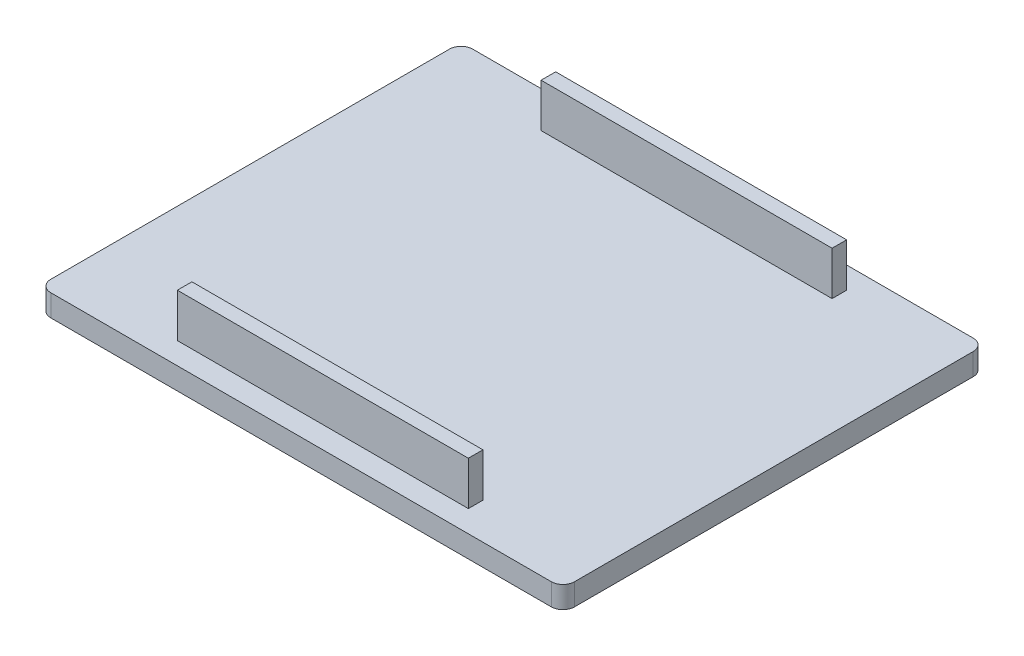
ISO-10303-21;
HEADER;
FILE_DESCRIPTION(('STEP AP214'),'2;1');
FILE_NAME('part.step','',(''),(''),'','','');
FILE_SCHEMA(('AUTOMOTIVE_DESIGN { 1 0 10303 214 1 1 1 1 }'));
ENDSEC;
DATA;
#1=APPLICATION_CONTEXT('core data for automotive mechanical design processes');
#2=APPLICATION_PROTOCOL_DEFINITION('international standard','automotive_design',2000,#1);
#3=PRODUCT_CONTEXT('',#1,'mechanical');
#4=PRODUCT('Part','Part','',(#3));
#5=PRODUCT_RELATED_PRODUCT_CATEGORY('part','',(#4));
#6=PRODUCT_DEFINITION_FORMATION('','',#4);
#7=PRODUCT_DEFINITION_CONTEXT('part definition',#1,'design');
#8=PRODUCT_DEFINITION('design','',#6,#7);
#9=PRODUCT_DEFINITION_SHAPE('','',#8);
#10=(LENGTH_UNIT() NAMED_UNIT(*) SI_UNIT(.MILLI.,.METRE.));
#11=(NAMED_UNIT(*) PLANE_ANGLE_UNIT() SI_UNIT($,.RADIAN.));
#12=(NAMED_UNIT(*) SI_UNIT($,.STERADIAN.) SOLID_ANGLE_UNIT());
#13=UNCERTAINTY_MEASURE_WITH_UNIT(LENGTH_MEASURE(1.E-05),#10,'distance_accuracy_value','');
#14=(GEOMETRIC_REPRESENTATION_CONTEXT(3) GLOBAL_UNCERTAINTY_ASSIGNED_CONTEXT((#13)) GLOBAL_UNIT_ASSIGNED_CONTEXT((#10,
#11,#12)) REPRESENTATION_CONTEXT('',''));
#15=CARTESIAN_POINT('',(0.,0.,0.));
#16=DIRECTION('',(0.,0.,1.));
#17=DIRECTION('',(1.,0.,0.));
#18=AXIS2_PLACEMENT_3D('',#15,#16,#17);
#19=CARTESIAN_POINT('',(0.,1.5,0.));
#20=DIRECTION('',(0.,1.,0.));
#21=DIRECTION('',(0.,0.,1.));
#22=AXIS2_PLACEMENT_3D('',#19,#20,#21);
#23=PLANE('',#22);
#24=DIRECTION('',(0.,0.,1.));
#25=VECTOR('',#24,1.);
#26=CARTESIAN_POINT('',(0.,1.5,0.));
#27=LINE('',#26,#25);
#28=CARTESIAN_POINT('',(0.,1.5,0.8));
#29=VERTEX_POINT('',#28);
#30=CARTESIAN_POINT('',(0.,1.5,28.2));
#31=VERTEX_POINT('',#30);
#32=EDGE_CURVE('E203',#29,#31,#27,.T.);
#33=ORIENTED_EDGE('',*,*,#32,.T.);
#34=CARTESIAN_POINT('',(0.8,1.5,28.2));
#35=DIRECTION('',(0.,1.,0.));
#36=DIRECTION('',(0.,0.,1.));
#37=AXIS2_PLACEMENT_3D('',#34,#35,#36);
#38=CIRCLE('',#37,0.8);
#39=CARTESIAN_POINT('',(0.8,1.5,29.));
#40=VERTEX_POINT('',#39);
#41=EDGE_CURVE('E250',#31,#40,#38,.T.);
#42=ORIENTED_EDGE('',*,*,#41,.T.);
#43=DIRECTION('',(1.,0.,0.));
#44=VECTOR('',#43,1.);
#45=CARTESIAN_POINT('',(0.,1.5,29.));
#46=LINE('',#45,#44);
#47=CARTESIAN_POINT('',(35.2,1.5,29.));
#48=VERTEX_POINT('',#47);
#49=EDGE_CURVE('E206',#40,#48,#46,.T.);
#50=ORIENTED_EDGE('',*,*,#49,.T.);
#51=CARTESIAN_POINT('',(35.2,1.5,28.2));
#52=DIRECTION('',(0.,1.,0.));
#53=DIRECTION('',(0.,0.,1.));
#54=AXIS2_PLACEMENT_3D('',#51,#52,#53);
#55=CIRCLE('',#54,0.8);
#56=CARTESIAN_POINT('',(36.,1.5,28.2));
#57=VERTEX_POINT('',#56);
#58=EDGE_CURVE('E244',#48,#57,#55,.T.);
#59=ORIENTED_EDGE('',*,*,#58,.T.);
#60=DIRECTION('',(0.,0.,-1.));
#61=VECTOR('',#60,1.);
#62=CARTESIAN_POINT('',(36.,1.5,0.));
#63=LINE('',#62,#61);
#64=CARTESIAN_POINT('',(36.,1.5,0.8));
#65=VERTEX_POINT('',#64);
#66=EDGE_CURVE('E210',#57,#65,#63,.T.);
#67=ORIENTED_EDGE('',*,*,#66,.T.);
#68=CARTESIAN_POINT('',(35.2,1.5,0.8));
#69=DIRECTION('',(0.,1.,0.));
#70=DIRECTION('',(0.,0.,1.));
#71=AXIS2_PLACEMENT_3D('',#68,#69,#70);
#72=CIRCLE('',#71,0.8);
#73=CARTESIAN_POINT('',(35.2,1.5,0.));
#74=VERTEX_POINT('',#73);
#75=EDGE_CURVE('E246',#65,#74,#72,.T.);
#76=ORIENTED_EDGE('',*,*,#75,.T.);
#77=DIRECTION('',(-1.,0.,0.));
#78=VECTOR('',#77,1.);
#79=CARTESIAN_POINT('',(0.,1.5,0.));
#80=LINE('',#79,#78);
#81=CARTESIAN_POINT('',(0.8,1.5,0.));
#82=VERTEX_POINT('',#81);
#83=EDGE_CURVE('E213',#74,#82,#80,.T.);
#84=ORIENTED_EDGE('',*,*,#83,.T.);
#85=CARTESIAN_POINT('',(0.8,1.5,0.8));
#86=DIRECTION('',(0.,1.,0.));
#87=DIRECTION('',(0.,0.,1.));
#88=AXIS2_PLACEMENT_3D('',#85,#86,#87);
#89=CIRCLE('',#88,0.8);
#90=EDGE_CURVE('E248',#82,#29,#89,.T.);
#91=ORIENTED_EDGE('',*,*,#90,.T.);
#92=EDGE_LOOP('',(#33,#42,#50,#59,#67,#76,#84,#91));
#93=FACE_BOUND('',#92,.T.);
#94=DIRECTION('',(1.,0.,0.));
#95=VECTOR('',#94,1.);
#96=CARTESIAN_POINT('',(8.,1.5,2.5));
#97=LINE('',#96,#95);
#98=CARTESIAN_POINT('',(8.,1.5,2.5));
#99=VERTEX_POINT('',#98);
#100=CARTESIAN_POINT('',(28.,1.5,2.5));
#101=VERTEX_POINT('',#100);
#102=EDGE_CURVE('E174',#99,#101,#97,.T.);
#103=ORIENTED_EDGE('',*,*,#102,.F.);
#104=DIRECTION('',(0.,0.,1.));
#105=VECTOR('',#104,1.);
#106=CARTESIAN_POINT('',(8.,1.5,1.5));
#107=LINE('',#106,#105);
#108=CARTESIAN_POINT('',(8.,1.5,1.5));
#109=VERTEX_POINT('',#108);
#110=EDGE_CURVE('E171',#109,#99,#107,.T.);
#111=ORIENTED_EDGE('',*,*,#110,.F.);
#112=DIRECTION('',(-1.,0.,0.));
#113=VECTOR('',#112,1.);
#114=CARTESIAN_POINT('',(8.,1.5,1.5));
#115=LINE('',#114,#113);
#116=CARTESIAN_POINT('',(28.,1.5,1.5));
#117=VERTEX_POINT('',#116);
#118=EDGE_CURVE('E183',#117,#109,#115,.T.);
#119=ORIENTED_EDGE('',*,*,#118,.F.);
#120=DIRECTION('',(0.,0.,-1.));
#121=VECTOR('',#120,1.);
#122=CARTESIAN_POINT('',(28.,1.5,1.5));
#123=LINE('',#122,#121);
#124=EDGE_CURVE('E191',#101,#117,#123,.T.);
#125=ORIENTED_EDGE('',*,*,#124,.F.);
#126=EDGE_LOOP('',(#103,#111,#119,#125));
#127=FACE_BOUND('',#126,.T.);
#128=DIRECTION('',(1.,0.,0.));
#129=VECTOR('',#128,1.);
#130=CARTESIAN_POINT('',(8.,1.5,27.5));
#131=LINE('',#130,#129);
#132=CARTESIAN_POINT('',(8.,1.5,27.5));
#133=VERTEX_POINT('',#132);
#134=CARTESIAN_POINT('',(28.,1.5,27.5));
#135=VERTEX_POINT('',#134);
#136=EDGE_CURVE('E437',#133,#135,#131,.T.);
#137=ORIENTED_EDGE('',*,*,#136,.F.);
#138=DIRECTION('',(0.,0.,1.));
#139=VECTOR('',#138,1.);
#140=CARTESIAN_POINT('',(8.,1.5,27.5));
#141=LINE('',#140,#139);
#142=CARTESIAN_POINT('',(8.,1.5,26.5));
#143=VERTEX_POINT('',#142);
#144=EDGE_CURVE('E169',#143,#133,#141,.T.);
#145=ORIENTED_EDGE('',*,*,#144,.F.);
#146=DIRECTION('',(-1.,0.,0.));
#147=VECTOR('',#146,1.);
#148=CARTESIAN_POINT('',(8.,1.5,26.5));
#149=LINE('',#148,#147);
#150=CARTESIAN_POINT('',(28.,1.5,26.5));
#151=VERTEX_POINT('',#150);
#152=EDGE_CURVE('E165',#151,#143,#149,.T.);
#153=ORIENTED_EDGE('',*,*,#152,.F.);
#154=DIRECTION('',(0.,0.,-1.));
#155=VECTOR('',#154,1.);
#156=CARTESIAN_POINT('',(28.,1.5,27.5));
#157=LINE('',#156,#155);
#158=EDGE_CURVE('E434',#135,#151,#157,.T.);
#159=ORIENTED_EDGE('',*,*,#158,.F.);
#160=EDGE_LOOP('',(#137,#145,#153,#159));
#161=FACE_BOUND('',#160,.T.);
#162=ADVANCED_FACE('F33',(#93,#127,#161),#23,.T.);
#163=CARTESIAN_POINT('',(0.,1.5,0.));
#164=DIRECTION('',(1.,0.,0.));
#165=DIRECTION('',(0.,0.,-1.));
#166=AXIS2_PLACEMENT_3D('',#163,#164,#165);
#167=PLANE('',#166);
#168=DIRECTION('',(0.,0.,1.));
#169=VECTOR('',#168,1.);
#170=CARTESIAN_POINT('',(0.,0.,0.));
#171=LINE('',#170,#169);
#172=CARTESIAN_POINT('',(0.,0.,0.8));
#173=VERTEX_POINT('',#172);
#174=CARTESIAN_POINT('',(0.,0.,28.2));
#175=VERTEX_POINT('',#174);
#176=EDGE_CURVE('E202',#173,#175,#171,.T.);
#177=ORIENTED_EDGE('',*,*,#176,.T.);
#178=DIRECTION('',(0.,-1.,0.));
#179=VECTOR('',#178,1.);
#180=CARTESIAN_POINT('',(0.,1.5,28.2));
#181=LINE('',#180,#179);
#182=EDGE_CURVE('E242',#175,#31,#181,.F.);
#183=ORIENTED_EDGE('',*,*,#182,.T.);
#184=ORIENTED_EDGE('',*,*,#32,.F.);
#185=DIRECTION('',(0.,-1.,0.));
#186=VECTOR('',#185,1.);
#187=CARTESIAN_POINT('',(0.,1.5,0.8));
#188=LINE('',#187,#186);
#189=EDGE_CURVE('E239',#29,#173,#188,.T.);
#190=ORIENTED_EDGE('',*,*,#189,.T.);
#191=EDGE_LOOP('',(#177,#183,#184,#190));
#192=FACE_BOUND('',#191,.T.);
#193=ADVANCED_FACE('F286',(#192),#167,.F.);
#194=CARTESIAN_POINT('',(0.,1.5,29.));
#195=DIRECTION('',(0.,0.,-1.));
#196=DIRECTION('',(-1.,0.,0.));
#197=AXIS2_PLACEMENT_3D('',#194,#195,#196);
#198=PLANE('',#197);
#199=ORIENTED_EDGE('',*,*,#49,.F.);
#200=DIRECTION('',(0.,-1.,0.));
#201=VECTOR('',#200,1.);
#202=CARTESIAN_POINT('',(0.8,1.5,29.));
#203=LINE('',#202,#201);
#204=CARTESIAN_POINT('',(0.8,0.,29.));
#205=VERTEX_POINT('',#204);
#206=EDGE_CURVE('E228',#40,#205,#203,.T.);
#207=ORIENTED_EDGE('',*,*,#206,.T.);
#208=DIRECTION('',(1.,0.,0.));
#209=VECTOR('',#208,1.);
#210=CARTESIAN_POINT('',(0.,0.,29.));
#211=LINE('',#210,#209);
#212=CARTESIAN_POINT('',(35.2,0.,29.));
#213=VERTEX_POINT('',#212);
#214=EDGE_CURVE('E219',#205,#213,#211,.T.);
#215=ORIENTED_EDGE('',*,*,#214,.T.);
#216=DIRECTION('',(0.,-1.,0.));
#217=VECTOR('',#216,1.);
#218=CARTESIAN_POINT('',(35.2,1.5,29.));
#219=LINE('',#218,#217);
#220=EDGE_CURVE('E216',#213,#48,#219,.F.);
#221=ORIENTED_EDGE('',*,*,#220,.T.);
#222=EDGE_LOOP('',(#199,#207,#215,#221));
#223=FACE_BOUND('',#222,.T.);
#224=ADVANCED_FACE('F294',(#223),#198,.F.);
#225=CARTESIAN_POINT('',(36.,1.5,0.));
#226=DIRECTION('',(-1.,0.,0.));
#227=DIRECTION('',(0.,0.,1.));
#228=AXIS2_PLACEMENT_3D('',#225,#226,#227);
#229=PLANE('',#228);
#230=DIRECTION('',(0.,0.,-1.));
#231=VECTOR('',#230,1.);
#232=CARTESIAN_POINT('',(36.,0.,0.));
#233=LINE('',#232,#231);
#234=CARTESIAN_POINT('',(36.,0.,28.2));
#235=VERTEX_POINT('',#234);
#236=CARTESIAN_POINT('',(36.,0.,0.8));
#237=VERTEX_POINT('',#236);
#238=EDGE_CURVE('E222',#235,#237,#233,.T.);
#239=ORIENTED_EDGE('',*,*,#238,.T.);
#240=DIRECTION('',(0.,-1.,0.));
#241=VECTOR('',#240,1.);
#242=CARTESIAN_POINT('',(36.,1.5,0.8));
#243=LINE('',#242,#241);
#244=EDGE_CURVE('E11',#237,#65,#243,.F.);
#245=ORIENTED_EDGE('',*,*,#244,.T.);
#246=ORIENTED_EDGE('',*,*,#66,.F.);
#247=DIRECTION('',(0.,-1.,0.));
#248=VECTOR('',#247,1.);
#249=CARTESIAN_POINT('',(36.,1.5,28.2));
#250=LINE('',#249,#248);
#251=EDGE_CURVE('E41',#57,#235,#250,.T.);
#252=ORIENTED_EDGE('',*,*,#251,.T.);
#253=EDGE_LOOP('',(#239,#245,#246,#252));
#254=FACE_BOUND('',#253,.T.);
#255=ADVANCED_FACE('F261',(#254),#229,.F.);
#256=CARTESIAN_POINT('',(0.,1.5,0.));
#257=DIRECTION('',(0.,0.,1.));
#258=DIRECTION('',(1.,0.,0.));
#259=AXIS2_PLACEMENT_3D('',#256,#257,#258);
#260=PLANE('',#259);
#261=DIRECTION('',(-1.,0.,0.));
#262=VECTOR('',#261,1.);
#263=CARTESIAN_POINT('',(0.,0.,0.));
#264=LINE('',#263,#262);
#265=CARTESIAN_POINT('',(35.2,0.,0.));
#266=VERTEX_POINT('',#265);
#267=CARTESIAN_POINT('',(0.8,0.,0.));
#268=VERTEX_POINT('',#267);
#269=EDGE_CURVE('E207',#266,#268,#264,.T.);
#270=ORIENTED_EDGE('',*,*,#269,.T.);
#271=DIRECTION('',(0.,-1.,0.));
#272=VECTOR('',#271,1.);
#273=CARTESIAN_POINT('',(0.8,1.5,0.));
#274=LINE('',#273,#272);
#275=EDGE_CURVE('E255',#268,#82,#274,.F.);
#276=ORIENTED_EDGE('',*,*,#275,.T.);
#277=ORIENTED_EDGE('',*,*,#83,.F.);
#278=DIRECTION('',(0.,-1.,0.));
#279=VECTOR('',#278,1.);
#280=CARTESIAN_POINT('',(35.2,1.5,0.));
#281=LINE('',#280,#279);
#282=EDGE_CURVE('E252',#74,#266,#281,.T.);
#283=ORIENTED_EDGE('',*,*,#282,.T.);
#284=EDGE_LOOP('',(#270,#276,#277,#283));
#285=FACE_BOUND('',#284,.T.);
#286=ADVANCED_FACE('F275',(#285),#260,.F.);
#287=CARTESIAN_POINT('',(0.,0.,0.));
#288=DIRECTION('',(0.,1.,0.));
#289=DIRECTION('',(0.,0.,1.));
#290=AXIS2_PLACEMENT_3D('',#287,#288,#289);
#291=PLANE('',#290);
#292=ORIENTED_EDGE('',*,*,#214,.F.);
#293=CARTESIAN_POINT('',(0.8,0.,28.2));
#294=DIRECTION('',(0.,1.,0.));
#295=DIRECTION('',(0.,0.,1.));
#296=AXIS2_PLACEMENT_3D('',#293,#294,#295);
#297=CIRCLE('',#296,0.8);
#298=EDGE_CURVE('E237',#205,#175,#297,.F.);
#299=ORIENTED_EDGE('',*,*,#298,.T.);
#300=ORIENTED_EDGE('',*,*,#176,.F.);
#301=CARTESIAN_POINT('',(0.8,0.,0.8));
#302=DIRECTION('',(0.,1.,0.));
#303=DIRECTION('',(0.,0.,1.));
#304=AXIS2_PLACEMENT_3D('',#301,#302,#303);
#305=CIRCLE('',#304,0.8);
#306=EDGE_CURVE('E235',#173,#268,#305,.F.);
#307=ORIENTED_EDGE('',*,*,#306,.T.);
#308=ORIENTED_EDGE('',*,*,#269,.F.);
#309=CARTESIAN_POINT('',(35.2,0.,0.8));
#310=DIRECTION('',(0.,1.,0.));
#311=DIRECTION('',(0.,0.,1.));
#312=AXIS2_PLACEMENT_3D('',#309,#310,#311);
#313=CIRCLE('',#312,0.8);
#314=EDGE_CURVE('E233',#266,#237,#313,.F.);
#315=ORIENTED_EDGE('',*,*,#314,.T.);
#316=ORIENTED_EDGE('',*,*,#238,.F.);
#317=CARTESIAN_POINT('',(35.2,0.,28.2));
#318=DIRECTION('',(0.,1.,0.));
#319=DIRECTION('',(0.,0.,1.));
#320=AXIS2_PLACEMENT_3D('',#317,#318,#319);
#321=CIRCLE('',#320,0.8);
#322=EDGE_CURVE('E231',#235,#213,#321,.F.);
#323=ORIENTED_EDGE('',*,*,#322,.T.);
#324=EDGE_LOOP('',(#292,#299,#300,#307,#308,#315,#316,#323));
#325=FACE_BOUND('',#324,.T.);
#326=ADVANCED_FACE('F267',(#325),#291,.F.);
#327=CARTESIAN_POINT('',(0.8,1.5,28.2));
#328=DIRECTION('',(0.,-1.,0.));
#329=DIRECTION('',(0.,0.,-1.));
#330=AXIS2_PLACEMENT_3D('',#327,#328,#329);
#331=CYLINDRICAL_SURFACE('',#330,0.8);
#332=ORIENTED_EDGE('',*,*,#41,.F.);
#333=ORIENTED_EDGE('',*,*,#182,.F.);
#334=ORIENTED_EDGE('',*,*,#298,.F.);
#335=ORIENTED_EDGE('',*,*,#206,.F.);
#336=EDGE_LOOP('',(#332,#333,#334,#335));
#337=FACE_BOUND('',#336,.T.);
#338=ADVANCED_FACE('F291',(#337),#331,.T.);
#339=CARTESIAN_POINT('',(0.8,1.5,0.8));
#340=DIRECTION('',(0.,-1.,0.));
#341=DIRECTION('',(0.,0.,-1.));
#342=AXIS2_PLACEMENT_3D('',#339,#340,#341);
#343=CYLINDRICAL_SURFACE('',#342,0.8);
#344=ORIENTED_EDGE('',*,*,#90,.F.);
#345=ORIENTED_EDGE('',*,*,#275,.F.);
#346=ORIENTED_EDGE('',*,*,#306,.F.);
#347=ORIENTED_EDGE('',*,*,#189,.F.);
#348=EDGE_LOOP('',(#344,#345,#346,#347));
#349=FACE_BOUND('',#348,.T.);
#350=ADVANCED_FACE('F283',(#349),#343,.T.);
#351=CARTESIAN_POINT('',(35.2,1.5,0.8));
#352=DIRECTION('',(0.,-1.,0.));
#353=DIRECTION('',(0.,0.,-1.));
#354=AXIS2_PLACEMENT_3D('',#351,#352,#353);
#355=CYLINDRICAL_SURFACE('',#354,0.8);
#356=ORIENTED_EDGE('',*,*,#75,.F.);
#357=ORIENTED_EDGE('',*,*,#244,.F.);
#358=ORIENTED_EDGE('',*,*,#314,.F.);
#359=ORIENTED_EDGE('',*,*,#282,.F.);
#360=EDGE_LOOP('',(#356,#357,#358,#359));
#361=FACE_BOUND('',#360,.T.);
#362=ADVANCED_FACE('F272',(#361),#355,.T.);
#363=CARTESIAN_POINT('',(35.2,1.5,28.2));
#364=DIRECTION('',(0.,-1.,0.));
#365=DIRECTION('',(0.,0.,-1.));
#366=AXIS2_PLACEMENT_3D('',#363,#364,#365);
#367=CYLINDRICAL_SURFACE('',#366,0.8);
#368=ORIENTED_EDGE('',*,*,#58,.F.);
#369=ORIENTED_EDGE('',*,*,#220,.F.);
#370=ORIENTED_EDGE('',*,*,#322,.F.);
#371=ORIENTED_EDGE('',*,*,#251,.F.);
#372=EDGE_LOOP('',(#368,#369,#370,#371));
#373=FACE_BOUND('',#372,.T.);
#374=ADVANCED_FACE('F35',(#373),#367,.T.);
#375=CARTESIAN_POINT('',(8.,4.5,1.5));
#376=DIRECTION('',(1.,0.,0.));
#377=DIRECTION('',(0.,0.,-1.));
#378=AXIS2_PLACEMENT_3D('',#375,#376,#377);
#379=PLANE('',#378);
#380=ORIENTED_EDGE('',*,*,#110,.T.);
#381=DIRECTION('',(0.,-1.,0.));
#382=VECTOR('',#381,1.);
#383=CARTESIAN_POINT('',(8.,4.5,2.5));
#384=LINE('',#383,#382);
#385=CARTESIAN_POINT('',(8.,4.5,2.5));
#386=VERTEX_POINT('',#385);
#387=EDGE_CURVE('E200',#386,#99,#384,.T.);
#388=ORIENTED_EDGE('',*,*,#387,.F.);
#389=DIRECTION('',(0.,0.,1.));
#390=VECTOR('',#389,1.);
#391=CARTESIAN_POINT('',(8.,4.5,1.5));
#392=LINE('',#391,#390);
#393=CARTESIAN_POINT('',(8.,4.5,1.5));
#394=VERTEX_POINT('',#393);
#395=EDGE_CURVE('E179',#394,#386,#392,.T.);
#396=ORIENTED_EDGE('',*,*,#395,.F.);
#397=DIRECTION('',(0.,-1.,0.));
#398=VECTOR('',#397,1.);
#399=CARTESIAN_POINT('',(8.,4.5,1.5));
#400=LINE('',#399,#398);
#401=EDGE_CURVE('E188',#394,#109,#400,.T.);
#402=ORIENTED_EDGE('',*,*,#401,.T.);
#403=EDGE_LOOP('',(#380,#388,#396,#402));
#404=FACE_BOUND('',#403,.T.);
#405=ADVANCED_FACE('F297',(#404),#379,.F.);
#406=CARTESIAN_POINT('',(8.,4.5,2.5));
#407=DIRECTION('',(0.,0.,-1.));
#408=DIRECTION('',(-1.,0.,0.));
#409=AXIS2_PLACEMENT_3D('',#406,#407,#408);
#410=PLANE('',#409);
#411=ORIENTED_EDGE('',*,*,#102,.T.);
#412=DIRECTION('',(0.,-1.,0.));
#413=VECTOR('',#412,1.);
#414=CARTESIAN_POINT('',(28.,4.5,2.5));
#415=LINE('',#414,#413);
#416=CARTESIAN_POINT('',(28.,4.5,2.5));
#417=VERTEX_POINT('',#416);
#418=EDGE_CURVE('E197',#417,#101,#415,.T.);
#419=ORIENTED_EDGE('',*,*,#418,.F.);
#420=DIRECTION('',(1.,0.,0.));
#421=VECTOR('',#420,1.);
#422=CARTESIAN_POINT('',(8.,4.5,2.5));
#423=LINE('',#422,#421);
#424=EDGE_CURVE('E182',#386,#417,#423,.T.);
#425=ORIENTED_EDGE('',*,*,#424,.F.);
#426=ORIENTED_EDGE('',*,*,#387,.T.);
#427=EDGE_LOOP('',(#411,#419,#425,#426));
#428=FACE_BOUND('',#427,.T.);
#429=ADVANCED_FACE('F302',(#428),#410,.F.);
#430=CARTESIAN_POINT('',(28.,4.5,1.5));
#431=DIRECTION('',(-1.,0.,0.));
#432=DIRECTION('',(0.,0.,1.));
#433=AXIS2_PLACEMENT_3D('',#430,#431,#432);
#434=PLANE('',#433);
#435=ORIENTED_EDGE('',*,*,#124,.T.);
#436=DIRECTION('',(0.,-1.,0.));
#437=VECTOR('',#436,1.);
#438=CARTESIAN_POINT('',(28.,4.5,1.5));
#439=LINE('',#438,#437);
#440=CARTESIAN_POINT('',(28.,4.5,1.5));
#441=VERTEX_POINT('',#440);
#442=EDGE_CURVE('E56',#441,#117,#439,.T.);
#443=ORIENTED_EDGE('',*,*,#442,.F.);
#444=DIRECTION('',(0.,0.,-1.));
#445=VECTOR('',#444,1.);
#446=CARTESIAN_POINT('',(28.,4.5,1.5));
#447=LINE('',#446,#445);
#448=EDGE_CURVE('E185',#417,#441,#447,.T.);
#449=ORIENTED_EDGE('',*,*,#448,.F.);
#450=ORIENTED_EDGE('',*,*,#418,.T.);
#451=EDGE_LOOP('',(#435,#443,#449,#450));
#452=FACE_BOUND('',#451,.T.);
#453=ADVANCED_FACE('F355',(#452),#434,.F.);
#454=CARTESIAN_POINT('',(8.,4.5,1.5));
#455=DIRECTION('',(0.,0.,1.));
#456=DIRECTION('',(1.,0.,0.));
#457=AXIS2_PLACEMENT_3D('',#454,#455,#456);
#458=PLANE('',#457);
#459=ORIENTED_EDGE('',*,*,#118,.T.);
#460=ORIENTED_EDGE('',*,*,#401,.F.);
#461=DIRECTION('',(-1.,0.,0.));
#462=VECTOR('',#461,1.);
#463=CARTESIAN_POINT('',(8.,4.5,1.5));
#464=LINE('',#463,#462);
#465=EDGE_CURVE('E187',#441,#394,#464,.T.);
#466=ORIENTED_EDGE('',*,*,#465,.F.);
#467=ORIENTED_EDGE('',*,*,#442,.T.);
#468=EDGE_LOOP('',(#459,#460,#466,#467));
#469=FACE_BOUND('',#468,.T.);
#470=ADVANCED_FACE('F364',(#469),#458,.F.);
#471=CARTESIAN_POINT('',(0.,4.5,0.));
#472=DIRECTION('',(0.,1.,0.));
#473=DIRECTION('',(0.,0.,1.));
#474=AXIS2_PLACEMENT_3D('',#471,#472,#473);
#475=PLANE('',#474);
#476=ORIENTED_EDGE('',*,*,#395,.T.);
#477=ORIENTED_EDGE('',*,*,#424,.T.);
#478=ORIENTED_EDGE('',*,*,#448,.T.);
#479=ORIENTED_EDGE('',*,*,#465,.T.);
#480=EDGE_LOOP('',(#476,#477,#478,#479));
#481=FACE_BOUND('',#480,.T.);
#482=ADVANCED_FACE('F374',(#481),#475,.T.);
#483=CARTESIAN_POINT('',(8.,4.5,27.5));
#484=DIRECTION('',(1.,0.,0.));
#485=DIRECTION('',(0.,0.,-1.));
#486=AXIS2_PLACEMENT_3D('',#483,#484,#485);
#487=PLANE('',#486);
#488=ORIENTED_EDGE('',*,*,#144,.T.);
#489=DIRECTION('',(0.,-1.,0.));
#490=VECTOR('',#489,1.);
#491=CARTESIAN_POINT('',(8.,4.5,27.5));
#492=LINE('',#491,#490);
#493=CARTESIAN_POINT('',(8.,4.5,27.5));
#494=VERTEX_POINT('',#493);
#495=EDGE_CURVE('E150',#494,#133,#492,.T.);
#496=ORIENTED_EDGE('',*,*,#495,.F.);
#497=DIRECTION('',(0.,0.,1.));
#498=VECTOR('',#497,1.);
#499=CARTESIAN_POINT('',(8.,4.5,27.5));
#500=LINE('',#499,#498);
#501=CARTESIAN_POINT('',(8.,4.5,26.5));
#502=VERTEX_POINT('',#501);
#503=EDGE_CURVE('E157',#502,#494,#500,.T.);
#504=ORIENTED_EDGE('',*,*,#503,.F.);
#505=DIRECTION('',(0.,-1.,0.));
#506=VECTOR('',#505,1.);
#507=CARTESIAN_POINT('',(8.,4.5,26.5));
#508=LINE('',#507,#506);
#509=EDGE_CURVE('E431',#502,#143,#508,.T.);
#510=ORIENTED_EDGE('',*,*,#509,.T.);
#511=EDGE_LOOP('',(#488,#496,#504,#510));
#512=FACE_BOUND('',#511,.T.);
#513=ADVANCED_FACE('F167',(#512),#487,.F.);
#514=CARTESIAN_POINT('',(8.,4.5,27.5));
#515=DIRECTION('',(0.,0.,-1.));
#516=DIRECTION('',(-1.,0.,0.));
#517=AXIS2_PLACEMENT_3D('',#514,#515,#516);
#518=PLANE('',#517);
#519=ORIENTED_EDGE('',*,*,#136,.T.);
#520=DIRECTION('',(0.,-1.,0.));
#521=VECTOR('',#520,1.);
#522=CARTESIAN_POINT('',(28.,4.5,27.5));
#523=LINE('',#522,#521);
#524=CARTESIAN_POINT('',(28.,4.5,27.5));
#525=VERTEX_POINT('',#524);
#526=EDGE_CURVE('E153',#525,#135,#523,.T.);
#527=ORIENTED_EDGE('',*,*,#526,.F.);
#528=DIRECTION('',(1.,0.,0.));
#529=VECTOR('',#528,1.);
#530=CARTESIAN_POINT('',(8.,4.5,27.5));
#531=LINE('',#530,#529);
#532=EDGE_CURVE('E146',#494,#525,#531,.T.);
#533=ORIENTED_EDGE('',*,*,#532,.F.);
#534=ORIENTED_EDGE('',*,*,#495,.T.);
#535=EDGE_LOOP('',(#519,#527,#533,#534));
#536=FACE_BOUND('',#535,.T.);
#537=ADVANCED_FACE('F148',(#536),#518,.F.);
#538=CARTESIAN_POINT('',(28.,4.5,27.5));
#539=DIRECTION('',(-1.,0.,0.));
#540=DIRECTION('',(0.,0.,1.));
#541=AXIS2_PLACEMENT_3D('',#538,#539,#540);
#542=PLANE('',#541);
#543=ORIENTED_EDGE('',*,*,#158,.T.);
#544=DIRECTION('',(0.,-1.,0.));
#545=VECTOR('',#544,1.);
#546=CARTESIAN_POINT('',(28.,4.5,26.5));
#547=LINE('',#546,#545);
#548=CARTESIAN_POINT('',(28.,4.5,26.5));
#549=VERTEX_POINT('',#548);
#550=EDGE_CURVE('E48',#549,#151,#547,.T.);
#551=ORIENTED_EDGE('',*,*,#550,.F.);
#552=DIRECTION('',(0.,0.,-1.));
#553=VECTOR('',#552,1.);
#554=CARTESIAN_POINT('',(28.,4.5,27.5));
#555=LINE('',#554,#553);
#556=EDGE_CURVE('E156',#525,#549,#555,.T.);
#557=ORIENTED_EDGE('',*,*,#556,.F.);
#558=ORIENTED_EDGE('',*,*,#526,.T.);
#559=EDGE_LOOP('',(#543,#551,#557,#558));
#560=FACE_BOUND('',#559,.T.);
#561=ADVANCED_FACE('F400',(#560),#542,.F.);
#562=CARTESIAN_POINT('',(8.,4.5,26.5));
#563=DIRECTION('',(0.,0.,1.));
#564=DIRECTION('',(1.,0.,0.));
#565=AXIS2_PLACEMENT_3D('',#562,#563,#564);
#566=PLANE('',#565);
#567=ORIENTED_EDGE('',*,*,#152,.T.);
#568=ORIENTED_EDGE('',*,*,#509,.F.);
#569=DIRECTION('',(-1.,0.,0.));
#570=VECTOR('',#569,1.);
#571=CARTESIAN_POINT('',(8.,4.5,26.5));
#572=LINE('',#571,#570);
#573=EDGE_CURVE('E161',#549,#502,#572,.T.);
#574=ORIENTED_EDGE('',*,*,#573,.F.);
#575=ORIENTED_EDGE('',*,*,#550,.T.);
#576=EDGE_LOOP('',(#567,#568,#574,#575));
#577=FACE_BOUND('',#576,.T.);
#578=ADVANCED_FACE('F409',(#577),#566,.F.);
#579=CARTESIAN_POINT('',(0.,4.5,0.));
#580=DIRECTION('',(0.,-1.,0.));
#581=DIRECTION('',(0.,0.,-1.));
#582=AXIS2_PLACEMENT_3D('',#579,#580,#581);
#583=PLANE('',#582);
#584=ORIENTED_EDGE('',*,*,#503,.T.);
#585=ORIENTED_EDGE('',*,*,#532,.T.);
#586=ORIENTED_EDGE('',*,*,#556,.T.);
#587=ORIENTED_EDGE('',*,*,#573,.T.);
#588=EDGE_LOOP('',(#584,#585,#586,#587));
#589=FACE_BOUND('',#588,.T.);
#590=ADVANCED_FACE('F160',(#589),#583,.F.);
#591=CLOSED_SHELL('',(#162,#193,#224,#255,#286,#326,#338,#350,#362,#374,#405,#429,#453,#470,
#482,#513,#537,#561,#578,#590));
#592=MANIFOLD_SOLID_BREP('B2',#591);
#593=ADVANCED_BREP_SHAPE_REPRESENTATION('',(#18,#592),#14);
#594=SHAPE_DEFINITION_REPRESENTATION(#9,#593);
ENDSEC;
END-ISO-10303-21;
